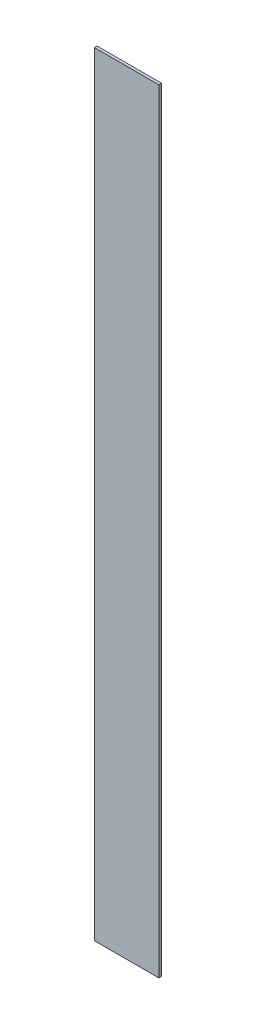
ISO-10303-21;
HEADER;
FILE_DESCRIPTION(('STEP AP214'),'2;1');
FILE_NAME('part.step','',(''),(''),'','','');
FILE_SCHEMA(('AUTOMOTIVE_DESIGN { 1 0 10303 214 1 1 1 1 }'));
ENDSEC;
DATA;
#1=APPLICATION_CONTEXT('core data for automotive mechanical design processes');
#2=APPLICATION_PROTOCOL_DEFINITION('international standard','automotive_design',2000,#1);
#3=PRODUCT_CONTEXT('',#1,'mechanical');
#4=PRODUCT('Part','Part','',(#3));
#5=PRODUCT_RELATED_PRODUCT_CATEGORY('part','',(#4));
#6=PRODUCT_DEFINITION_FORMATION('','',#4);
#7=PRODUCT_DEFINITION_CONTEXT('part definition',#1,'design');
#8=PRODUCT_DEFINITION('design','',#6,#7);
#9=PRODUCT_DEFINITION_SHAPE('','',#8);
#10=(LENGTH_UNIT() NAMED_UNIT(*) SI_UNIT(.MILLI.,.METRE.));
#11=(NAMED_UNIT(*) PLANE_ANGLE_UNIT() SI_UNIT($,.RADIAN.));
#12=(NAMED_UNIT(*) SI_UNIT($,.STERADIAN.) SOLID_ANGLE_UNIT());
#13=UNCERTAINTY_MEASURE_WITH_UNIT(LENGTH_MEASURE(1.E-05),#10,'distance_accuracy_value','');
#14=(GEOMETRIC_REPRESENTATION_CONTEXT(3) GLOBAL_UNCERTAINTY_ASSIGNED_CONTEXT((#13)) GLOBAL_UNIT_ASSIGNED_CONTEXT((#10,
#11,#12)) REPRESENTATION_CONTEXT('',''));
#15=CARTESIAN_POINT('',(0.,0.,0.));
#16=DIRECTION('',(0.,0.,1.));
#17=DIRECTION('',(1.,0.,0.));
#18=AXIS2_PLACEMENT_3D('',#15,#16,#17);
#19=CARTESIAN_POINT('',(38.1,-457.2,1.5875));
#20=DIRECTION('',(-1.,0.,0.));
#21=DIRECTION('',(0.,0.,1.));
#22=AXIS2_PLACEMENT_3D('',#19,#20,#21);
#23=PLANE('',#22);
#24=DIRECTION('',(0.,1.,0.));
#25=VECTOR('',#24,1.);
#26=CARTESIAN_POINT('',(38.1,-457.2,-1.5875));
#27=LINE('',#26,#25);
#28=CARTESIAN_POINT('',(38.1,-457.2,-1.5875));
#29=VERTEX_POINT('',#28);
#30=CARTESIAN_POINT('',(38.1,457.2,-1.5875));
#31=VERTEX_POINT('',#30);
#32=EDGE_CURVE('E107',#29,#31,#27,.T.);
#33=ORIENTED_EDGE('',*,*,#32,.T.);
#34=DIRECTION('',(0.,0.,-1.));
#35=VECTOR('',#34,1.);
#36=CARTESIAN_POINT('',(38.1,457.2,1.5875));
#37=LINE('',#36,#35);
#38=CARTESIAN_POINT('',(38.1,457.2,1.5875));
#39=VERTEX_POINT('',#38);
#40=EDGE_CURVE('E11',#39,#31,#37,.T.);
#41=ORIENTED_EDGE('',*,*,#40,.F.);
#42=DIRECTION('',(0.,1.,0.));
#43=VECTOR('',#42,1.);
#44=CARTESIAN_POINT('',(38.1,-457.2,1.5875));
#45=LINE('',#44,#43);
#46=CARTESIAN_POINT('',(38.1,-457.2,1.5875));
#47=VERTEX_POINT('',#46);
#48=EDGE_CURVE('E91',#47,#39,#45,.T.);
#49=ORIENTED_EDGE('',*,*,#48,.F.);
#50=DIRECTION('',(0.,0.,-1.));
#51=VECTOR('',#50,1.);
#52=CARTESIAN_POINT('',(38.1,-457.2,1.5875));
#53=LINE('',#52,#51);
#54=EDGE_CURVE('E103',#47,#29,#53,.T.);
#55=ORIENTED_EDGE('',*,*,#54,.T.);
#56=EDGE_LOOP('',(#33,#41,#49,#55));
#57=FACE_BOUND('',#56,.T.);
#58=ADVANCED_FACE('F39',(#57),#23,.F.);
#59=CARTESIAN_POINT('',(-38.1,457.2,1.5875));
#60=DIRECTION('',(0.,-1.,0.));
#61=DIRECTION('',(0.,0.,-1.));
#62=AXIS2_PLACEMENT_3D('',#59,#60,#61);
#63=PLANE('',#62);
#64=DIRECTION('',(-1.,0.,0.));
#65=VECTOR('',#64,1.);
#66=CARTESIAN_POINT('',(-38.1,457.2,-1.5875));
#67=LINE('',#66,#65);
#68=CARTESIAN_POINT('',(-38.1,457.2,-1.5875));
#69=VERTEX_POINT('',#68);
#70=EDGE_CURVE('E96',#31,#69,#67,.T.);
#71=ORIENTED_EDGE('',*,*,#70,.T.);
#72=DIRECTION('',(0.,0.,-1.));
#73=VECTOR('',#72,1.);
#74=CARTESIAN_POINT('',(-38.1,457.2,1.5875));
#75=LINE('',#74,#73);
#76=CARTESIAN_POINT('',(-38.1,457.2,1.5875));
#77=VERTEX_POINT('',#76);
#78=EDGE_CURVE('E48',#77,#69,#75,.T.);
#79=ORIENTED_EDGE('',*,*,#78,.F.);
#80=DIRECTION('',(-1.,0.,0.));
#81=VECTOR('',#80,1.);
#82=CARTESIAN_POINT('',(-38.1,457.2,1.5875));
#83=LINE('',#82,#81);
#84=EDGE_CURVE('E86',#39,#77,#83,.T.);
#85=ORIENTED_EDGE('',*,*,#84,.F.);
#86=ORIENTED_EDGE('',*,*,#40,.T.);
#87=EDGE_LOOP('',(#71,#79,#85,#86));
#88=FACE_BOUND('',#87,.T.);
#89=ADVANCED_FACE('F95',(#88),#63,.F.);
#90=CARTESIAN_POINT('',(-38.1,-457.2,1.5875));
#91=DIRECTION('',(1.,0.,0.));
#92=DIRECTION('',(0.,0.,-1.));
#93=AXIS2_PLACEMENT_3D('',#90,#91,#92);
#94=PLANE('',#93);
#95=DIRECTION('',(0.,-1.,0.));
#96=VECTOR('',#95,1.);
#97=CARTESIAN_POINT('',(-38.1,-457.2,-1.5875));
#98=LINE('',#97,#96);
#99=CARTESIAN_POINT('',(-38.1,-457.2,-1.5875));
#100=VERTEX_POINT('',#99);
#101=EDGE_CURVE('E73',#69,#100,#98,.T.);
#102=ORIENTED_EDGE('',*,*,#101,.T.);
#103=DIRECTION('',(0.,0.,-1.));
#104=VECTOR('',#103,1.);
#105=CARTESIAN_POINT('',(-38.1,-457.2,1.5875));
#106=LINE('',#105,#104);
#107=CARTESIAN_POINT('',(-38.1,-457.2,1.5875));
#108=VERTEX_POINT('',#107);
#109=EDGE_CURVE('E98',#108,#100,#106,.T.);
#110=ORIENTED_EDGE('',*,*,#109,.F.);
#111=DIRECTION('',(0.,-1.,0.));
#112=VECTOR('',#111,1.);
#113=CARTESIAN_POINT('',(-38.1,-457.2,1.5875));
#114=LINE('',#113,#112);
#115=EDGE_CURVE('E89',#77,#108,#114,.T.);
#116=ORIENTED_EDGE('',*,*,#115,.F.);
#117=ORIENTED_EDGE('',*,*,#78,.T.);
#118=EDGE_LOOP('',(#102,#110,#116,#117));
#119=FACE_BOUND('',#118,.T.);
#120=ADVANCED_FACE('F99',(#119),#94,.F.);
#121=CARTESIAN_POINT('',(-38.1,-457.2,1.5875));
#122=DIRECTION('',(0.,1.,0.));
#123=DIRECTION('',(0.,0.,1.));
#124=AXIS2_PLACEMENT_3D('',#121,#122,#123);
#125=PLANE('',#124);
#126=DIRECTION('',(1.,0.,0.));
#127=VECTOR('',#126,1.);
#128=CARTESIAN_POINT('',(-38.1,-457.2,-1.5875));
#129=LINE('',#128,#127);
#130=EDGE_CURVE('E79',#100,#29,#129,.T.);
#131=ORIENTED_EDGE('',*,*,#130,.T.);
#132=ORIENTED_EDGE('',*,*,#54,.F.);
#133=DIRECTION('',(1.,0.,0.));
#134=VECTOR('',#133,1.);
#135=CARTESIAN_POINT('',(-38.1,-457.2,1.5875));
#136=LINE('',#135,#134);
#137=EDGE_CURVE('E56',#108,#47,#136,.T.);
#138=ORIENTED_EDGE('',*,*,#137,.F.);
#139=ORIENTED_EDGE('',*,*,#109,.T.);
#140=EDGE_LOOP('',(#131,#132,#138,#139));
#141=FACE_BOUND('',#140,.T.);
#142=ADVANCED_FACE('F120',(#141),#125,.F.);
#143=CARTESIAN_POINT('',(0.,0.,1.5875));
#144=DIRECTION('',(0.,0.,-1.));
#145=DIRECTION('',(-1.,0.,0.));
#146=AXIS2_PLACEMENT_3D('',#143,#144,#145);
#147=PLANE('',#146);
#148=ORIENTED_EDGE('',*,*,#48,.T.);
#149=ORIENTED_EDGE('',*,*,#84,.T.);
#150=ORIENTED_EDGE('',*,*,#115,.T.);
#151=ORIENTED_EDGE('',*,*,#137,.T.);
#152=EDGE_LOOP('',(#148,#149,#150,#151));
#153=FACE_BOUND('',#152,.T.);
#154=ADVANCED_FACE('F87',(#153),#147,.F.);
#155=CARTESIAN_POINT('',(0.,0.,-1.5875));
#156=DIRECTION('',(0.,0.,-1.));
#157=DIRECTION('',(-1.,0.,0.));
#158=AXIS2_PLACEMENT_3D('',#155,#156,#157);
#159=PLANE('',#158);
#160=ORIENTED_EDGE('',*,*,#32,.F.);
#161=ORIENTED_EDGE('',*,*,#130,.F.);
#162=ORIENTED_EDGE('',*,*,#101,.F.);
#163=ORIENTED_EDGE('',*,*,#70,.F.);
#164=EDGE_LOOP('',(#160,#161,#162,#163));
#165=FACE_BOUND('',#164,.T.);
#166=ADVANCED_FACE('F123',(#165),#159,.T.);
#167=CLOSED_SHELL('',(#58,#89,#120,#142,#154,#166));
#168=MANIFOLD_SOLID_BREP('B2',#167);
#169=ADVANCED_BREP_SHAPE_REPRESENTATION('',(#18,#168),#14);
#170=SHAPE_DEFINITION_REPRESENTATION(#9,#169);
ENDSEC;
END-ISO-10303-21;
